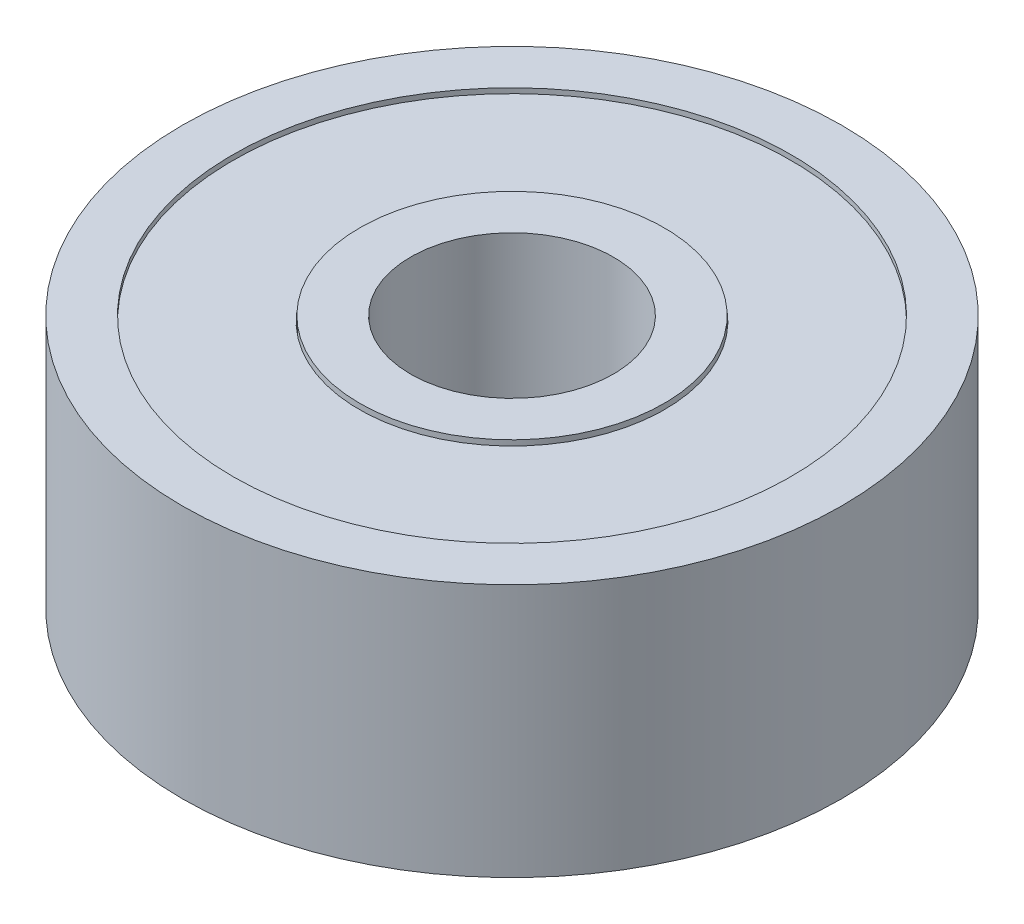
ISO-10303-21;
HEADER;
FILE_DESCRIPTION(('STEP AP214'),'2;1');
FILE_NAME('part.step','',(''),(''),'','','');
FILE_SCHEMA(('AUTOMOTIVE_DESIGN { 1 0 10303 214 1 1 1 1 }'));
ENDSEC;
DATA;
#1=APPLICATION_CONTEXT('core data for automotive mechanical design processes');
#2=APPLICATION_PROTOCOL_DEFINITION('international standard','automotive_design',2000,#1);
#3=PRODUCT_CONTEXT('',#1,'mechanical');
#4=PRODUCT('Part','Part','',(#3));
#5=PRODUCT_RELATED_PRODUCT_CATEGORY('part','',(#4));
#6=PRODUCT_DEFINITION_FORMATION('','',#4);
#7=PRODUCT_DEFINITION_CONTEXT('part definition',#1,'design');
#8=PRODUCT_DEFINITION('design','',#6,#7);
#9=PRODUCT_DEFINITION_SHAPE('','',#8);
#10=(LENGTH_UNIT() NAMED_UNIT(*) SI_UNIT(.MILLI.,.METRE.));
#11=(NAMED_UNIT(*) PLANE_ANGLE_UNIT() SI_UNIT($,.RADIAN.));
#12=(NAMED_UNIT(*) SI_UNIT($,.STERADIAN.) SOLID_ANGLE_UNIT());
#13=UNCERTAINTY_MEASURE_WITH_UNIT(LENGTH_MEASURE(1.E-05),#10,'distance_accuracy_value','');
#14=(GEOMETRIC_REPRESENTATION_CONTEXT(3) GLOBAL_UNCERTAINTY_ASSIGNED_CONTEXT((#13)) GLOBAL_UNIT_ASSIGNED_CONTEXT((#10,
#11,#12)) REPRESENTATION_CONTEXT('',''));
#15=CARTESIAN_POINT('',(0.,0.,0.));
#16=DIRECTION('',(0.,0.,1.));
#17=DIRECTION('',(1.,0.,0.));
#18=AXIS2_PLACEMENT_3D('',#15,#16,#17);
#19=CARTESIAN_POINT('',(0.,4.9,0.));
#20=DIRECTION('',(0.,-1.,0.));
#21=DIRECTION('',(0.,0.,-1.));
#22=AXIS2_PLACEMENT_3D('',#19,#20,#21);
#23=CYLINDRICAL_SURFACE('',#22,5.99);
#24=CARTESIAN_POINT('',(0.,4.9,0.));
#25=DIRECTION('',(0.,-1.,0.));
#26=DIRECTION('',(0.,0.,-1.));
#27=AXIS2_PLACEMENT_3D('',#24,#25,#26);
#28=CIRCLE('',#27,5.99);
#29=CARTESIAN_POINT('',(0.,4.9,-5.99));
#30=VERTEX_POINT('',#29);
#31=EDGE_CURVE('E11',#30,#30,#28,.T.);
#32=ORIENTED_EDGE('',*,*,#31,.T.);
#33=EDGE_LOOP('',(#32));
#34=FACE_BOUND('',#33,.T.);
#35=CARTESIAN_POINT('',(0.,0.1,0.));
#36=DIRECTION('',(0.,-1.,0.));
#37=DIRECTION('',(0.,0.,-1.));
#38=AXIS2_PLACEMENT_3D('',#35,#36,#37);
#39=CIRCLE('',#38,5.99);
#40=CARTESIAN_POINT('',(0.,0.1,-5.99));
#41=VERTEX_POINT('',#40);
#42=EDGE_CURVE('E43',#41,#41,#39,.T.);
#43=ORIENTED_EDGE('',*,*,#42,.F.);
#44=EDGE_LOOP('',(#43));
#45=FACE_BOUND('',#44,.T.);
#46=ADVANCED_FACE('F40',(#34,#45),#23,.T.);
#47=CARTESIAN_POINT('',(0.,4.9,0.));
#48=DIRECTION('',(0.,-1.,0.));
#49=DIRECTION('',(0.,0.,-1.));
#50=AXIS2_PLACEMENT_3D('',#47,#48,#49);
#51=PLANE('',#50);
#52=CARTESIAN_POINT('',(0.,4.9,0.));
#53=DIRECTION('',(0.,-1.,0.));
#54=DIRECTION('',(0.,0.,-1.));
#55=AXIS2_PLACEMENT_3D('',#52,#53,#54);
#56=CIRCLE('',#55,3.01);
#57=CARTESIAN_POINT('',(0.,4.9,-3.01));
#58=VERTEX_POINT('',#57);
#59=EDGE_CURVE('E50',#58,#58,#56,.T.);
#60=ORIENTED_EDGE('',*,*,#59,.T.);
#61=EDGE_LOOP('',(#60));
#62=FACE_BOUND('',#61,.T.);
#63=ORIENTED_EDGE('',*,*,#31,.F.);
#64=EDGE_LOOP('',(#63));
#65=FACE_BOUND('',#64,.T.);
#66=ADVANCED_FACE('F58',(#62,#65),#51,.F.);
#67=CARTESIAN_POINT('',(0.,0.1,0.));
#68=DIRECTION('',(0.,-1.,0.));
#69=DIRECTION('',(0.,0.,-1.));
#70=AXIS2_PLACEMENT_3D('',#67,#68,#69);
#71=PLANE('',#70);
#72=CARTESIAN_POINT('',(0.,0.1,0.));
#73=DIRECTION('',(0.,-1.,0.));
#74=DIRECTION('',(0.,0.,-1.));
#75=AXIS2_PLACEMENT_3D('',#72,#73,#74);
#76=CIRCLE('',#75,3.01);
#77=CARTESIAN_POINT('',(0.,0.1,-3.01));
#78=VERTEX_POINT('',#77);
#79=EDGE_CURVE('E52',#78,#78,#76,.T.);
#80=ORIENTED_EDGE('',*,*,#79,.F.);
#81=EDGE_LOOP('',(#80));
#82=FACE_BOUND('',#81,.T.);
#83=ORIENTED_EDGE('',*,*,#42,.T.);
#84=EDGE_LOOP('',(#83));
#85=FACE_BOUND('',#84,.T.);
#86=ADVANCED_FACE('F64',(#82,#85),#71,.T.);
#87=CARTESIAN_POINT('',(0.,4.9,0.));
#88=DIRECTION('',(0.,-1.,0.));
#89=DIRECTION('',(0.,0.,-1.));
#90=AXIS2_PLACEMENT_3D('',#87,#88,#89);
#91=CYLINDRICAL_SURFACE('',#90,3.01);
#92=ORIENTED_EDGE('',*,*,#59,.F.);
#93=EDGE_LOOP('',(#92));
#94=FACE_BOUND('',#93,.T.);
#95=ORIENTED_EDGE('',*,*,#79,.T.);
#96=EDGE_LOOP('',(#95));
#97=FACE_BOUND('',#96,.T.);
#98=ADVANCED_FACE('F61',(#94,#97),#91,.F.);
#99=CLOSED_SHELL('',(#46,#66,#86,#98));
#100=MANIFOLD_SOLID_BREP('B2',#99);
#101=CARTESIAN_POINT('',(0.,5.,0.));
#102=DIRECTION('',(0.,1.,0.));
#103=DIRECTION('',(0.,0.,1.));
#104=AXIS2_PLACEMENT_3D('',#101,#102,#103);
#105=PLANE('',#104);
#106=CARTESIAN_POINT('',(0.,5.,0.));
#107=DIRECTION('',(0.,1.,0.));
#108=DIRECTION('',(0.,0.,1.));
#109=AXIS2_PLACEMENT_3D('',#106,#107,#108);
#110=CIRCLE('',#109,5.5);
#111=CARTESIAN_POINT('',(0.,5.,5.5));
#112=VERTEX_POINT('',#111);
#113=EDGE_CURVE('E116',#112,#112,#110,.T.);
#114=ORIENTED_EDGE('',*,*,#113,.F.);
#115=EDGE_LOOP('',(#114));
#116=FACE_BOUND('',#115,.T.);
#117=CARTESIAN_POINT('',(0.,5.,0.));
#118=DIRECTION('',(0.,1.,0.));
#119=DIRECTION('',(0.,0.,1.));
#120=AXIS2_PLACEMENT_3D('',#117,#118,#119);
#121=CIRCLE('',#120,6.5);
#122=CARTESIAN_POINT('',(0.,5.,6.5));
#123=VERTEX_POINT('',#122);
#124=EDGE_CURVE('E124',#123,#123,#121,.T.);
#125=ORIENTED_EDGE('',*,*,#124,.T.);
#126=EDGE_LOOP('',(#125));
#127=FACE_BOUND('',#126,.T.);
#128=ADVANCED_FACE('F109',(#116,#127),#105,.T.);
#129=CARTESIAN_POINT('',(0.,0.,0.));
#130=DIRECTION('',(0.,1.,0.));
#131=DIRECTION('',(0.,0.,1.));
#132=AXIS2_PLACEMENT_3D('',#129,#130,#131);
#133=PLANE('',#132);
#134=CARTESIAN_POINT('',(0.,0.,0.));
#135=DIRECTION('',(0.,1.,0.));
#136=DIRECTION('',(0.,0.,1.));
#137=AXIS2_PLACEMENT_3D('',#134,#135,#136);
#138=CIRCLE('',#137,5.5);
#139=CARTESIAN_POINT('',(0.,0.,5.5));
#140=VERTEX_POINT('',#139);
#141=EDGE_CURVE('E39',#140,#140,#138,.F.);
#142=ORIENTED_EDGE('',*,*,#141,.F.);
#143=EDGE_LOOP('',(#142));
#144=FACE_BOUND('',#143,.T.);
#145=CARTESIAN_POINT('',(0.,0.,0.));
#146=DIRECTION('',(0.,1.,0.));
#147=DIRECTION('',(0.,0.,1.));
#148=AXIS2_PLACEMENT_3D('',#145,#146,#147);
#149=CIRCLE('',#148,6.5);
#150=CARTESIAN_POINT('',(0.,0.,6.5));
#151=VERTEX_POINT('',#150);
#152=EDGE_CURVE('E120',#151,#151,#149,.T.);
#153=ORIENTED_EDGE('',*,*,#152,.F.);
#154=EDGE_LOOP('',(#153));
#155=FACE_BOUND('',#154,.T.);
#156=ADVANCED_FACE('F111',(#144,#155),#133,.F.);
#157=CARTESIAN_POINT('',(0.,5.,0.));
#158=DIRECTION('',(0.,-1.,0.));
#159=DIRECTION('',(0.,0.,-1.));
#160=AXIS2_PLACEMENT_3D('',#157,#158,#159);
#161=CYLINDRICAL_SURFACE('',#160,6.5);
#162=ORIENTED_EDGE('',*,*,#124,.F.);
#163=EDGE_LOOP('',(#162));
#164=FACE_BOUND('',#163,.T.);
#165=ORIENTED_EDGE('',*,*,#152,.T.);
#166=EDGE_LOOP('',(#165));
#167=FACE_BOUND('',#166,.T.);
#168=ADVANCED_FACE('F131',(#164,#167),#161,.T.);
#169=CARTESIAN_POINT('',(0.,-0.00100000000000013,0.));
#170=DIRECTION('',(0.,1.,0.));
#171=DIRECTION('',(0.,0.,1.));
#172=AXIS2_PLACEMENT_3D('',#169,#170,#171);
#173=CYLINDRICAL_SURFACE('',#172,5.5);
#174=ORIENTED_EDGE('',*,*,#113,.T.);
#175=EDGE_LOOP('',(#174));
#176=FACE_BOUND('',#175,.T.);
#177=ORIENTED_EDGE('',*,*,#141,.T.);
#178=EDGE_LOOP('',(#177));
#179=FACE_BOUND('',#178,.T.);
#180=ADVANCED_FACE('F134',(#176,#179),#173,.F.);
#181=CLOSED_SHELL('',(#128,#156,#168,#180));
#182=MANIFOLD_SOLID_BREP('B6',#181);
#183=CARTESIAN_POINT('',(0.,5.,0.));
#184=DIRECTION('',(0.,1.,0.));
#185=DIRECTION('',(0.,0.,1.));
#186=AXIS2_PLACEMENT_3D('',#183,#184,#185);
#187=PLANE('',#186);
#188=CARTESIAN_POINT('',(0.,5.,0.));
#189=DIRECTION('',(0.,1.,0.));
#190=DIRECTION('',(0.,0.,1.));
#191=AXIS2_PLACEMENT_3D('',#188,#189,#190);
#192=CIRCLE('',#191,2.);
#193=CARTESIAN_POINT('',(0.,5.,2.));
#194=VERTEX_POINT('',#193);
#195=EDGE_CURVE('E108',#194,#194,#192,.T.);
#196=ORIENTED_EDGE('',*,*,#195,.F.);
#197=EDGE_LOOP('',(#196));
#198=FACE_BOUND('',#197,.T.);
#199=CARTESIAN_POINT('',(0.,5.,0.));
#200=DIRECTION('',(0.,1.,0.));
#201=DIRECTION('',(0.,0.,1.));
#202=AXIS2_PLACEMENT_3D('',#199,#200,#201);
#203=CIRCLE('',#202,3.);
#204=CARTESIAN_POINT('',(0.,5.,3.));
#205=VERTEX_POINT('',#204);
#206=EDGE_CURVE('E182',#205,#205,#203,.T.);
#207=ORIENTED_EDGE('',*,*,#206,.T.);
#208=EDGE_LOOP('',(#207));
#209=FACE_BOUND('',#208,.T.);
#210=ADVANCED_FACE('F171',(#198,#209),#187,.T.);
#211=CARTESIAN_POINT('',(0.,5.,0.));
#212=DIRECTION('',(0.,-1.,0.));
#213=DIRECTION('',(0.,0.,-1.));
#214=AXIS2_PLACEMENT_3D('',#211,#212,#213);
#215=CYLINDRICAL_SURFACE('',#214,2.);
#216=ORIENTED_EDGE('',*,*,#195,.T.);
#217=EDGE_LOOP('',(#216));
#218=FACE_BOUND('',#217,.T.);
#219=CARTESIAN_POINT('',(0.,0.,0.));
#220=DIRECTION('',(0.,1.,0.));
#221=DIRECTION('',(0.,0.,1.));
#222=AXIS2_PLACEMENT_3D('',#219,#220,#221);
#223=CIRCLE('',#222,2.);
#224=CARTESIAN_POINT('',(0.,0.,2.));
#225=VERTEX_POINT('',#224);
#226=EDGE_CURVE('E175',#225,#225,#223,.T.);
#227=ORIENTED_EDGE('',*,*,#226,.F.);
#228=EDGE_LOOP('',(#227));
#229=FACE_BOUND('',#228,.T.);
#230=ADVANCED_FACE('F198',(#218,#229),#215,.F.);
#231=CARTESIAN_POINT('',(0.,0.,0.));
#232=DIRECTION('',(0.,1.,0.));
#233=DIRECTION('',(0.,0.,1.));
#234=AXIS2_PLACEMENT_3D('',#231,#232,#233);
#235=PLANE('',#234);
#236=ORIENTED_EDGE('',*,*,#226,.T.);
#237=EDGE_LOOP('',(#236));
#238=FACE_BOUND('',#237,.T.);
#239=CARTESIAN_POINT('',(0.,0.,0.));
#240=DIRECTION('',(0.,1.,0.));
#241=DIRECTION('',(0.,0.,1.));
#242=AXIS2_PLACEMENT_3D('',#239,#240,#241);
#243=CIRCLE('',#242,3.);
#244=CARTESIAN_POINT('',(0.,0.,3.));
#245=VERTEX_POINT('',#244);
#246=EDGE_CURVE('E184',#245,#245,#243,.F.);
#247=ORIENTED_EDGE('',*,*,#246,.T.);
#248=EDGE_LOOP('',(#247));
#249=FACE_BOUND('',#248,.T.);
#250=ADVANCED_FACE('F173',(#238,#249),#235,.F.);
#251=CARTESIAN_POINT('',(0.,-0.00100000000000013,0.));
#252=DIRECTION('',(0.,1.,0.));
#253=DIRECTION('',(0.,0.,1.));
#254=AXIS2_PLACEMENT_3D('',#251,#252,#253);
#255=CYLINDRICAL_SURFACE('',#254,3.);
#256=ORIENTED_EDGE('',*,*,#206,.F.);
#257=EDGE_LOOP('',(#256));
#258=FACE_BOUND('',#257,.T.);
#259=ORIENTED_EDGE('',*,*,#246,.F.);
#260=EDGE_LOOP('',(#259));
#261=FACE_BOUND('',#260,.T.);
#262=ADVANCED_FACE('F191',(#258,#261),#255,.T.);
#263=CLOSED_SHELL('',(#210,#230,#250,#262));
#264=MANIFOLD_SOLID_BREP('B34',#263);
#265=ADVANCED_BREP_SHAPE_REPRESENTATION('',(#18,#100,#182,#264),#14);
#266=SHAPE_DEFINITION_REPRESENTATION(#9,#265);
ENDSEC;
END-ISO-10303-21;
